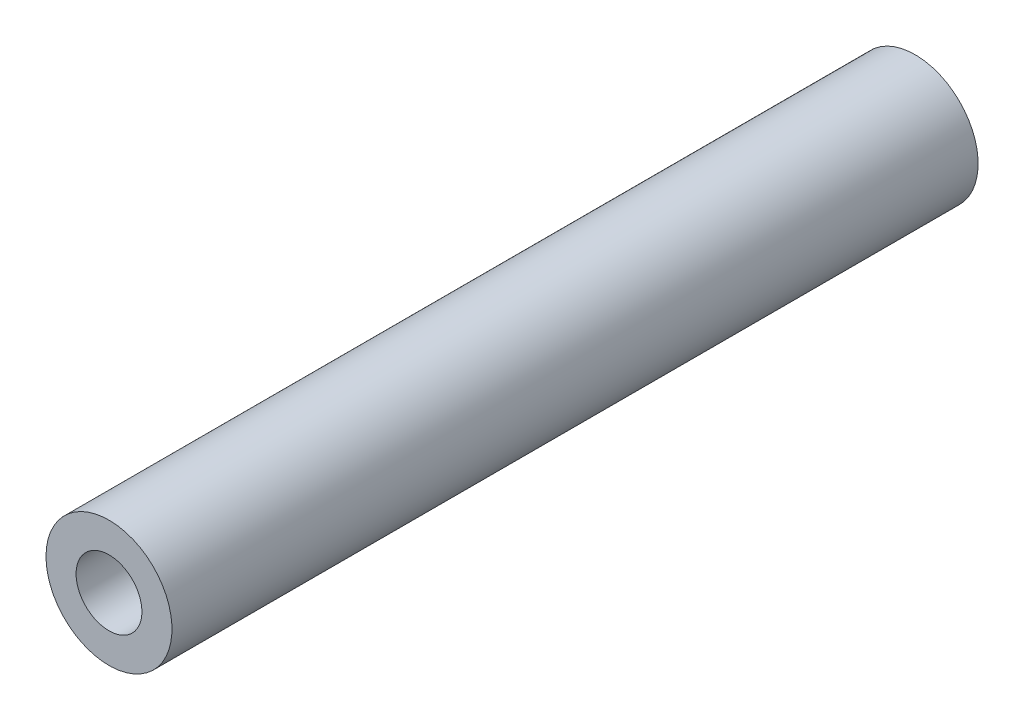
ISO-10303-21;
HEADER;
FILE_DESCRIPTION(('STEP AP214'),'2;1');
FILE_NAME('part.step','',(''),(''),'','','');
FILE_SCHEMA(('AUTOMOTIVE_DESIGN { 1 0 10303 214 1 1 1 1 }'));
ENDSEC;
DATA;
#1=APPLICATION_CONTEXT('core data for automotive mechanical design processes');
#2=APPLICATION_PROTOCOL_DEFINITION('international standard','automotive_design',2000,#1);
#3=PRODUCT_CONTEXT('',#1,'mechanical');
#4=PRODUCT('Part','Part','',(#3));
#5=PRODUCT_RELATED_PRODUCT_CATEGORY('part','',(#4));
#6=PRODUCT_DEFINITION_FORMATION('','',#4);
#7=PRODUCT_DEFINITION_CONTEXT('part definition',#1,'design');
#8=PRODUCT_DEFINITION('design','',#6,#7);
#9=PRODUCT_DEFINITION_SHAPE('','',#8);
#10=(LENGTH_UNIT() NAMED_UNIT(*) SI_UNIT(.MILLI.,.METRE.));
#11=(NAMED_UNIT(*) PLANE_ANGLE_UNIT() SI_UNIT($,.RADIAN.));
#12=(NAMED_UNIT(*) SI_UNIT($,.STERADIAN.) SOLID_ANGLE_UNIT());
#13=UNCERTAINTY_MEASURE_WITH_UNIT(LENGTH_MEASURE(1.E-05),#10,'distance_accuracy_value','');
#14=(GEOMETRIC_REPRESENTATION_CONTEXT(3) GLOBAL_UNCERTAINTY_ASSIGNED_CONTEXT((#13)) GLOBAL_UNIT_ASSIGNED_CONTEXT((#10,
#11,#12)) REPRESENTATION_CONTEXT('',''));
#15=CARTESIAN_POINT('',(0.,0.,0.));
#16=DIRECTION('',(0.,0.,1.));
#17=DIRECTION('',(1.,0.,0.));
#18=AXIS2_PLACEMENT_3D('',#15,#16,#17);
#19=CARTESIAN_POINT('',(0.,0.,30.48));
#20=DIRECTION('',(0.,0.,1.));
#21=DIRECTION('',(1.,0.,0.));
#22=AXIS2_PLACEMENT_3D('',#19,#20,#21);
#23=PLANE('',#22);
#24=CARTESIAN_POINT('',(0.,0.,30.48));
#25=DIRECTION('',(0.,0.,1.));
#26=DIRECTION('',(1.,0.,0.));
#27=AXIS2_PLACEMENT_3D('',#24,#25,#26);
#28=CIRCLE('',#27,4.7625);
#29=CARTESIAN_POINT('',(-4.7625,0.,30.48));
#30=VERTEX_POINT('',#29);
#31=EDGE_CURVE('E10',#30,#30,#28,.T.);
#32=ORIENTED_EDGE('',*,*,#31,.T.);
#33=EDGE_LOOP('',(#32));
#34=FACE_BOUND('',#33,.T.);
#35=CARTESIAN_POINT('',(0.,0.,30.48));
#36=DIRECTION('',(0.,0.,1.));
#37=DIRECTION('',(1.,0.,0.));
#38=AXIS2_PLACEMENT_3D('',#35,#36,#37);
#39=CIRCLE('',#38,2.4892);
#40=CARTESIAN_POINT('',(-2.4892,0.,30.48));
#41=VERTEX_POINT('',#40);
#42=EDGE_CURVE('E56',#41,#41,#39,.T.);
#43=ORIENTED_EDGE('',*,*,#42,.F.);
#44=EDGE_LOOP('',(#43));
#45=FACE_BOUND('',#44,.T.);
#46=ADVANCED_FACE('F43',(#34,#45),#23,.T.);
#47=CARTESIAN_POINT('',(0.,0.,-30.48));
#48=DIRECTION('',(0.,0.,1.));
#49=DIRECTION('',(1.,0.,0.));
#50=AXIS2_PLACEMENT_3D('',#47,#48,#49);
#51=PLANE('',#50);
#52=CARTESIAN_POINT('',(0.,0.,-30.48));
#53=DIRECTION('',(0.,0.,1.));
#54=DIRECTION('',(1.,0.,0.));
#55=AXIS2_PLACEMENT_3D('',#52,#53,#54);
#56=CIRCLE('',#55,4.7625);
#57=CARTESIAN_POINT('',(-4.7625,0.,-30.48));
#58=VERTEX_POINT('',#57);
#59=EDGE_CURVE('E47',#58,#58,#56,.T.);
#60=ORIENTED_EDGE('',*,*,#59,.F.);
#61=EDGE_LOOP('',(#60));
#62=FACE_BOUND('',#61,.T.);
#63=CARTESIAN_POINT('',(0.,0.,-30.48));
#64=DIRECTION('',(0.,0.,1.));
#65=DIRECTION('',(1.,0.,0.));
#66=AXIS2_PLACEMENT_3D('',#63,#64,#65);
#67=CIRCLE('',#66,2.4892);
#68=CARTESIAN_POINT('',(-2.4892,0.,-30.48));
#69=VERTEX_POINT('',#68);
#70=EDGE_CURVE('E58',#69,#69,#67,.T.);
#71=ORIENTED_EDGE('',*,*,#70,.T.);
#72=EDGE_LOOP('',(#71));
#73=FACE_BOUND('',#72,.T.);
#74=ADVANCED_FACE('F70',(#62,#73),#51,.F.);
#75=CARTESIAN_POINT('',(0.,0.,30.48));
#76=DIRECTION('',(0.,0.,-1.));
#77=DIRECTION('',(-1.,0.,0.));
#78=AXIS2_PLACEMENT_3D('',#75,#76,#77);
#79=CYLINDRICAL_SURFACE('',#78,4.7625);
#80=CARTESIAN_POINT('',(-4.7625,0.,30.48));
#81=CARTESIAN_POINT('',(-4.7625,0.,29.845));
#82=CARTESIAN_POINT('',(-4.7625,0.,29.21));
#83=CARTESIAN_POINT('',(-4.7625,0.,27.94));
#84=CARTESIAN_POINT('',(-4.7625,0.,27.305));
#85=CARTESIAN_POINT('',(-4.7625,0.,26.035));
#86=CARTESIAN_POINT('',(-4.7625,0.,25.4));
#87=CARTESIAN_POINT('',(-4.7625,0.,24.13));
#88=CARTESIAN_POINT('',(-4.7625,0.,23.495));
#89=CARTESIAN_POINT('',(-4.7625,0.,22.225));
#90=CARTESIAN_POINT('',(-4.7625,0.,21.59));
#91=CARTESIAN_POINT('',(-4.7625,0.,20.32));
#92=CARTESIAN_POINT('',(-4.7625,0.,19.685));
#93=CARTESIAN_POINT('',(-4.7625,0.,18.415));
#94=CARTESIAN_POINT('',(-4.7625,0.,17.78));
#95=CARTESIAN_POINT('',(-4.7625,0.,16.51));
#96=CARTESIAN_POINT('',(-4.7625,0.,15.875));
#97=CARTESIAN_POINT('',(-4.7625,0.,14.605));
#98=CARTESIAN_POINT('',(-4.7625,0.,13.97));
#99=CARTESIAN_POINT('',(-4.7625,0.,12.7));
#100=CARTESIAN_POINT('',(-4.7625,0.,12.065));
#101=CARTESIAN_POINT('',(-4.7625,0.,10.795));
#102=CARTESIAN_POINT('',(-4.7625,0.,10.16));
#103=CARTESIAN_POINT('',(-4.7625,0.,8.89));
#104=CARTESIAN_POINT('',(-4.7625,0.,8.255));
#105=CARTESIAN_POINT('',(-4.7625,0.,6.985));
#106=CARTESIAN_POINT('',(-4.7625,0.,6.35));
#107=CARTESIAN_POINT('',(-4.7625,0.,5.08));
#108=CARTESIAN_POINT('',(-4.7625,0.,4.445));
#109=CARTESIAN_POINT('',(-4.7625,0.,3.175));
#110=CARTESIAN_POINT('',(-4.7625,0.,2.54));
#111=CARTESIAN_POINT('',(-4.7625,0.,1.27));
#112=CARTESIAN_POINT('',(-4.7625,0.,0.635));
#113=CARTESIAN_POINT('',(-4.7625,0.,-0.634999999999998));
#114=CARTESIAN_POINT('',(-4.7625,0.,-1.27));
#115=CARTESIAN_POINT('',(-4.7625,0.,-2.54));
#116=CARTESIAN_POINT('',(-4.7625,0.,-3.175));
#117=CARTESIAN_POINT('',(-4.7625,0.,-4.445));
#118=CARTESIAN_POINT('',(-4.7625,0.,-5.07999999999999));
#119=CARTESIAN_POINT('',(-4.7625,0.,-6.35));
#120=CARTESIAN_POINT('',(-4.7625,0.,-6.985));
#121=CARTESIAN_POINT('',(-4.7625,0.,-8.255));
#122=CARTESIAN_POINT('',(-4.7625,0.,-8.89));
#123=CARTESIAN_POINT('',(-4.7625,0.,-10.16));
#124=CARTESIAN_POINT('',(-4.7625,0.,-10.795));
#125=CARTESIAN_POINT('',(-4.7625,0.,-12.065));
#126=CARTESIAN_POINT('',(-4.7625,0.,-12.7));
#127=CARTESIAN_POINT('',(-4.7625,0.,-13.97));
#128=CARTESIAN_POINT('',(-4.7625,0.,-14.605));
#129=CARTESIAN_POINT('',(-4.7625,0.,-15.875));
#130=CARTESIAN_POINT('',(-4.7625,0.,-16.51));
#131=CARTESIAN_POINT('',(-4.7625,0.,-17.78));
#132=CARTESIAN_POINT('',(-4.7625,0.,-18.415));
#133=CARTESIAN_POINT('',(-4.7625,0.,-19.685));
#134=CARTESIAN_POINT('',(-4.7625,0.,-20.32));
#135=CARTESIAN_POINT('',(-4.7625,0.,-21.59));
#136=CARTESIAN_POINT('',(-4.7625,0.,-22.225));
#137=CARTESIAN_POINT('',(-4.7625,0.,-23.495));
#138=CARTESIAN_POINT('',(-4.7625,0.,-24.13));
#139=CARTESIAN_POINT('',(-4.7625,0.,-25.4));
#140=CARTESIAN_POINT('',(-4.7625,0.,-26.035));
#141=CARTESIAN_POINT('',(-4.7625,0.,-27.305));
#142=CARTESIAN_POINT('',(-4.7625,0.,-27.94));
#143=CARTESIAN_POINT('',(-4.7625,0.,-29.21));
#144=CARTESIAN_POINT('',(-4.7625,0.,-29.845));
#145=CARTESIAN_POINT('',(-4.7625,0.,-30.48));
#146=B_SPLINE_CURVE_WITH_KNOTS('',3,(#80,#81,#82,#83,#84,#85,#86,#87,#88,#89,#90,#91,#92,#93,
#94,#95,#96,#97,#98,#99,#100,#101,#102,#103,#104,#105,#106,#107,#108,#109,#110,#111,#112,#113,
#114,#115,#116,#117,#118,#119,#120,#121,#122,#123,#124,#125,#126,#127,#128,#129,#130,#131,#132,
#133,#134,#135,#136,#137,#138,#139,#140,#141,#142,#143,#144,#145),.UNSPECIFIED.,.F.,.F.,(4,2,2,
2,2,2,2,2,2,2,2,2,2,2,2,2,2,2,2,2,2,2,2,2,2,2,2,2,2,2,2,2,4),(0.,1.905,3.81,5.715,7.62,9.525,
11.43,13.335,15.24,17.145,19.05,20.955,22.86,24.765,26.67,28.575,30.48,32.385,34.29,36.195,38.1,
40.005,41.91,43.815,45.72,47.625,49.53,51.435,53.34,55.245,57.15,59.055,60.96),.UNSPECIFIED.);
#147=EDGE_CURVE('BSEAM45',#30,#58,#146,.T.);
#148=ORIENTED_EDGE('',*,*,#31,.F.);
#149=ORIENTED_EDGE('',*,*,#59,.T.);
#150=ORIENTED_EDGE('',*,*,#147,.T.);
#151=ORIENTED_EDGE('',*,*,#147,.F.);
#152=EDGE_LOOP('',(#148,#150,#149,#151));
#153=FACE_BOUND('',#152,.T.);
#154=ADVANCED_FACE('F45',(#153),#79,.T.);
#155=CARTESIAN_POINT('',(0.,0.,30.48));
#156=DIRECTION('',(0.,0.,-1.));
#157=DIRECTION('',(-1.,0.,0.));
#158=AXIS2_PLACEMENT_3D('',#155,#156,#157);
#159=CYLINDRICAL_SURFACE('',#158,2.4892);
#160=CARTESIAN_POINT('',(-2.4892,0.,30.48));
#161=CARTESIAN_POINT('',(-2.4892,0.,29.845));
#162=CARTESIAN_POINT('',(-2.4892,0.,29.21));
#163=CARTESIAN_POINT('',(-2.4892,0.,27.94));
#164=CARTESIAN_POINT('',(-2.4892,0.,27.305));
#165=CARTESIAN_POINT('',(-2.4892,0.,26.035));
#166=CARTESIAN_POINT('',(-2.4892,0.,25.4));
#167=CARTESIAN_POINT('',(-2.4892,0.,24.13));
#168=CARTESIAN_POINT('',(-2.4892,0.,23.495));
#169=CARTESIAN_POINT('',(-2.4892,0.,22.225));
#170=CARTESIAN_POINT('',(-2.4892,0.,21.59));
#171=CARTESIAN_POINT('',(-2.4892,0.,20.32));
#172=CARTESIAN_POINT('',(-2.4892,0.,19.685));
#173=CARTESIAN_POINT('',(-2.4892,0.,18.415));
#174=CARTESIAN_POINT('',(-2.4892,0.,17.78));
#175=CARTESIAN_POINT('',(-2.4892,0.,16.51));
#176=CARTESIAN_POINT('',(-2.4892,0.,15.875));
#177=CARTESIAN_POINT('',(-2.4892,0.,14.605));
#178=CARTESIAN_POINT('',(-2.4892,0.,13.97));
#179=CARTESIAN_POINT('',(-2.4892,0.,12.7));
#180=CARTESIAN_POINT('',(-2.4892,0.,12.065));
#181=CARTESIAN_POINT('',(-2.4892,0.,10.795));
#182=CARTESIAN_POINT('',(-2.4892,0.,10.16));
#183=CARTESIAN_POINT('',(-2.4892,0.,8.89));
#184=CARTESIAN_POINT('',(-2.4892,0.,8.255));
#185=CARTESIAN_POINT('',(-2.4892,0.,6.985));
#186=CARTESIAN_POINT('',(-2.4892,0.,6.35));
#187=CARTESIAN_POINT('',(-2.4892,0.,5.08));
#188=CARTESIAN_POINT('',(-2.4892,0.,4.445));
#189=CARTESIAN_POINT('',(-2.4892,0.,3.175));
#190=CARTESIAN_POINT('',(-2.4892,0.,2.54));
#191=CARTESIAN_POINT('',(-2.4892,0.,1.27));
#192=CARTESIAN_POINT('',(-2.4892,0.,0.634999999999997));
#193=CARTESIAN_POINT('',(-2.4892,0.,-0.635));
#194=CARTESIAN_POINT('',(-2.4892,0.,-1.27));
#195=CARTESIAN_POINT('',(-2.4892,0.,-2.53999999999999));
#196=CARTESIAN_POINT('',(-2.4892,0.,-3.175));
#197=CARTESIAN_POINT('',(-2.4892,0.,-4.445));
#198=CARTESIAN_POINT('',(-2.4892,0.,-5.07999999999999));
#199=CARTESIAN_POINT('',(-2.4892,0.,-6.35));
#200=CARTESIAN_POINT('',(-2.4892,0.,-6.985));
#201=CARTESIAN_POINT('',(-2.4892,0.,-8.255));
#202=CARTESIAN_POINT('',(-2.4892,0.,-8.89));
#203=CARTESIAN_POINT('',(-2.4892,0.,-10.16));
#204=CARTESIAN_POINT('',(-2.4892,0.,-10.795));
#205=CARTESIAN_POINT('',(-2.4892,0.,-12.065));
#206=CARTESIAN_POINT('',(-2.4892,0.,-12.7));
#207=CARTESIAN_POINT('',(-2.4892,0.,-13.97));
#208=CARTESIAN_POINT('',(-2.4892,0.,-14.605));
#209=CARTESIAN_POINT('',(-2.4892,0.,-15.875));
#210=CARTESIAN_POINT('',(-2.4892,0.,-16.51));
#211=CARTESIAN_POINT('',(-2.4892,0.,-17.78));
#212=CARTESIAN_POINT('',(-2.4892,0.,-18.415));
#213=CARTESIAN_POINT('',(-2.4892,0.,-19.685));
#214=CARTESIAN_POINT('',(-2.4892,0.,-20.32));
#215=CARTESIAN_POINT('',(-2.4892,0.,-21.59));
#216=CARTESIAN_POINT('',(-2.4892,0.,-22.225));
#217=CARTESIAN_POINT('',(-2.4892,0.,-23.495));
#218=CARTESIAN_POINT('',(-2.4892,0.,-24.13));
#219=CARTESIAN_POINT('',(-2.4892,0.,-25.4));
#220=CARTESIAN_POINT('',(-2.4892,0.,-26.035));
#221=CARTESIAN_POINT('',(-2.4892,0.,-27.305));
#222=CARTESIAN_POINT('',(-2.4892,0.,-27.94));
#223=CARTESIAN_POINT('',(-2.4892,0.,-29.21));
#224=CARTESIAN_POINT('',(-2.4892,0.,-29.845));
#225=CARTESIAN_POINT('',(-2.4892,0.,-30.48));
#226=B_SPLINE_CURVE_WITH_KNOTS('',3,(#160,#161,#162,#163,#164,#165,#166,#167,#168,#169,#170,
#171,#172,#173,#174,#175,#176,#177,#178,#179,#180,#181,#182,#183,#184,#185,#186,#187,#188,#189,
#190,#191,#192,#193,#194,#195,#196,#197,#198,#199,#200,#201,#202,#203,#204,#205,#206,#207,#208,
#209,#210,#211,#212,#213,#214,#215,#216,#217,#218,#219,#220,#221,#222,#223,#224,#225),
.UNSPECIFIED.,.F.,.F.,(4,2,2,2,2,2,2,2,2,2,2,2,2,2,2,2,2,2,2,2,2,2,2,2,2,2,2,2,2,2,2,2,4),(0.,
1.905,3.81,5.715,7.62,9.525,11.43,13.335,15.24,17.145,19.05,20.955,22.86,24.765,26.67,28.575,
30.48,32.385,34.29,36.195,38.1,40.005,41.91,43.815,45.72,47.625,49.53,51.435,53.34,55.245,57.15,
59.055,60.96),.UNSPECIFIED.);
#227=EDGE_CURVE('BSEAM66',#41,#69,#226,.T.);
#228=ORIENTED_EDGE('',*,*,#42,.T.);
#229=ORIENTED_EDGE('',*,*,#70,.F.);
#230=ORIENTED_EDGE('',*,*,#227,.T.);
#231=ORIENTED_EDGE('',*,*,#227,.F.);
#232=EDGE_LOOP('',(#228,#230,#229,#231));
#233=FACE_BOUND('',#232,.T.);
#234=ADVANCED_FACE('F66',(#233),#159,.F.);
#235=CLOSED_SHELL('',(#46,#74,#154,#234));
#236=MANIFOLD_SOLID_BREP('B2',#235);
#237=ADVANCED_BREP_SHAPE_REPRESENTATION('',(#18,#236),#14);
#238=SHAPE_DEFINITION_REPRESENTATION(#9,#237);
ENDSEC;
END-ISO-10303-21;
